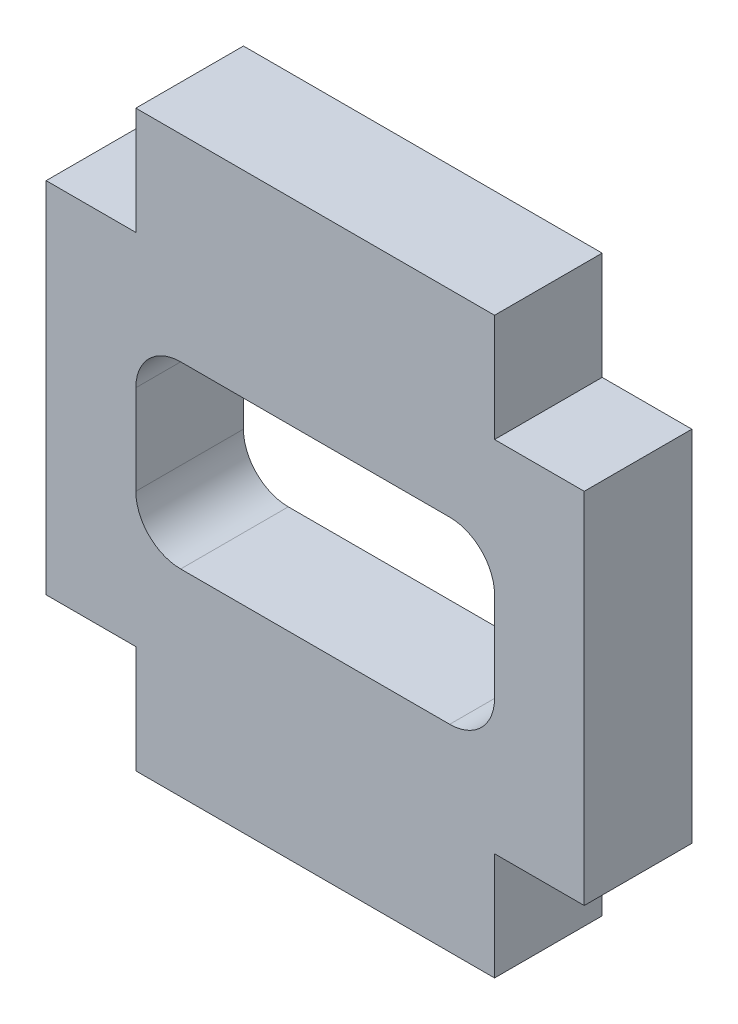
ISO-10303-21;
HEADER;
FILE_DESCRIPTION(('STEP AP214'),'2;1');
FILE_NAME('part.step','',(''),(''),'','','');
FILE_SCHEMA(('AUTOMOTIVE_DESIGN { 1 0 10303 214 1 1 1 1 }'));
ENDSEC;
DATA;
#1=APPLICATION_CONTEXT('core data for automotive mechanical design processes');
#2=APPLICATION_PROTOCOL_DEFINITION('international standard','automotive_design',2000,#1);
#3=PRODUCT_CONTEXT('',#1,'mechanical');
#4=PRODUCT('Part','Part','',(#3));
#5=PRODUCT_RELATED_PRODUCT_CATEGORY('part','',(#4));
#6=PRODUCT_DEFINITION_FORMATION('','',#4);
#7=PRODUCT_DEFINITION_CONTEXT('part definition',#1,'design');
#8=PRODUCT_DEFINITION('design','',#6,#7);
#9=PRODUCT_DEFINITION_SHAPE('','',#8);
#10=(LENGTH_UNIT() NAMED_UNIT(*) SI_UNIT(.MILLI.,.METRE.));
#11=(NAMED_UNIT(*) PLANE_ANGLE_UNIT() SI_UNIT($,.RADIAN.));
#12=(NAMED_UNIT(*) SI_UNIT($,.STERADIAN.) SOLID_ANGLE_UNIT());
#13=UNCERTAINTY_MEASURE_WITH_UNIT(LENGTH_MEASURE(1.E-05),#10,'distance_accuracy_value','');
#14=(GEOMETRIC_REPRESENTATION_CONTEXT(3) GLOBAL_UNCERTAINTY_ASSIGNED_CONTEXT((#13)) GLOBAL_UNIT_ASSIGNED_CONTEXT((#10,
#11,#12)) REPRESENTATION_CONTEXT('',''));
#15=CARTESIAN_POINT('',(0.,0.,0.));
#16=DIRECTION('',(0.,0.,1.));
#17=DIRECTION('',(1.,0.,0.));
#18=AXIS2_PLACEMENT_3D('',#15,#16,#17);
#19=CARTESIAN_POINT('',(5.,0.,3.));
#20=DIRECTION('',(-1.,0.,0.));
#21=DIRECTION('',(0.,0.,1.));
#22=AXIS2_PLACEMENT_3D('',#19,#20,#21);
#23=PLANE('',#22);
#24=DIRECTION('',(0.,1.,0.));
#25=VECTOR('',#24,1.);
#26=CARTESIAN_POINT('',(5.,0.,0.));
#27=LINE('',#26,#25);
#28=CARTESIAN_POINT('',(5.,-1.24999999999999,0.));
#29=VERTEX_POINT('',#28);
#30=CARTESIAN_POINT('',(5.,1.24999999999999,0.));
#31=VERTEX_POINT('',#30);
#32=EDGE_CURVE('E238',#29,#31,#27,.T.);
#33=ORIENTED_EDGE('',*,*,#32,.F.);
#34=DIRECTION('',(0.,0.,-1.));
#35=VECTOR('',#34,1.);
#36=CARTESIAN_POINT('',(5.,-1.24999999999999,3.));
#37=LINE('',#36,#35);
#38=CARTESIAN_POINT('',(5.,-1.24999999999999,3.));
#39=VERTEX_POINT('',#38);
#40=EDGE_CURVE('E11',#39,#29,#37,.T.);
#41=ORIENTED_EDGE('',*,*,#40,.F.);
#42=DIRECTION('',(0.,1.,0.));
#43=VECTOR('',#42,1.);
#44=CARTESIAN_POINT('',(5.,0.,3.));
#45=LINE('',#44,#43);
#46=CARTESIAN_POINT('',(5.,1.24999999999999,3.));
#47=VERTEX_POINT('',#46);
#48=EDGE_CURVE('E342',#39,#47,#45,.T.);
#49=ORIENTED_EDGE('',*,*,#48,.T.);
#50=DIRECTION('',(0.,0.,-1.));
#51=VECTOR('',#50,1.);
#52=CARTESIAN_POINT('',(5.,1.24999999999999,3.));
#53=LINE('',#52,#51);
#54=EDGE_CURVE('E53',#47,#31,#53,.T.);
#55=ORIENTED_EDGE('',*,*,#54,.T.);
#56=EDGE_LOOP('',(#33,#41,#49,#55));
#57=FACE_BOUND('',#56,.T.);
#58=ADVANCED_FACE('F34',(#57),#23,.T.);
#59=CARTESIAN_POINT('',(3.75,-1.25,3.));
#60=DIRECTION('',(0.,0.,-1.));
#61=DIRECTION('',(-1.,0.,0.));
#62=AXIS2_PLACEMENT_3D('',#59,#60,#61);
#63=CYLINDRICAL_SURFACE('',#62,1.25);
#64=CARTESIAN_POINT('',(3.75,-1.25,0.));
#65=DIRECTION('',(0.,0.,1.));
#66=DIRECTION('',(1.,0.,0.));
#67=AXIS2_PLACEMENT_3D('',#64,#65,#66);
#68=CIRCLE('',#67,1.25);
#69=CARTESIAN_POINT('',(3.74999999999999,-2.5,0.));
#70=VERTEX_POINT('',#69);
#71=EDGE_CURVE('E240',#29,#70,#68,.F.);
#72=ORIENTED_EDGE('',*,*,#71,.T.);
#73=DIRECTION('',(0.,0.,-1.));
#74=VECTOR('',#73,1.);
#75=CARTESIAN_POINT('',(3.74999999999999,-2.5,3.));
#76=LINE('',#75,#74);
#77=CARTESIAN_POINT('',(3.74999999999999,-2.5,3.));
#78=VERTEX_POINT('',#77);
#79=EDGE_CURVE('E44',#78,#70,#76,.T.);
#80=ORIENTED_EDGE('',*,*,#79,.F.);
#81=CARTESIAN_POINT('',(3.75,-1.25,3.));
#82=DIRECTION('',(0.,0.,1.));
#83=DIRECTION('',(1.,0.,0.));
#84=AXIS2_PLACEMENT_3D('',#81,#82,#83);
#85=CIRCLE('',#84,1.25);
#86=EDGE_CURVE('E344',#39,#78,#85,.F.);
#87=ORIENTED_EDGE('',*,*,#86,.F.);
#88=ORIENTED_EDGE('',*,*,#40,.T.);
#89=EDGE_LOOP('',(#72,#80,#87,#88));
#90=FACE_BOUND('',#89,.T.);
#91=ADVANCED_FACE('F373',(#90),#63,.F.);
#92=CARTESIAN_POINT('',(0.,-2.5,3.));
#93=DIRECTION('',(0.,-1.,0.));
#94=DIRECTION('',(1.,0.,0.));
#95=AXIS2_PLACEMENT_3D('',#92,#93,#94);
#96=PLANE('',#95);
#97=DIRECTION('',(-1.,0.,0.));
#98=VECTOR('',#97,1.);
#99=CARTESIAN_POINT('',(0.,-2.5,0.));
#100=LINE('',#99,#98);
#101=CARTESIAN_POINT('',(-3.74999999999999,-2.5,0.));
#102=VERTEX_POINT('',#101);
#103=EDGE_CURVE('E243',#70,#102,#100,.T.);
#104=ORIENTED_EDGE('',*,*,#103,.T.);
#105=DIRECTION('',(0.,0.,-1.));
#106=VECTOR('',#105,1.);
#107=CARTESIAN_POINT('',(-3.74999999999999,-2.5,3.));
#108=LINE('',#107,#106);
#109=CARTESIAN_POINT('',(-3.74999999999999,-2.5,3.));
#110=VERTEX_POINT('',#109);
#111=EDGE_CURVE('E265',#110,#102,#108,.T.);
#112=ORIENTED_EDGE('',*,*,#111,.F.);
#113=DIRECTION('',(-1.,0.,0.));
#114=VECTOR('',#113,1.);
#115=CARTESIAN_POINT('',(0.,-2.5,3.));
#116=LINE('',#115,#114);
#117=EDGE_CURVE('E347',#78,#110,#116,.T.);
#118=ORIENTED_EDGE('',*,*,#117,.F.);
#119=ORIENTED_EDGE('',*,*,#79,.T.);
#120=EDGE_LOOP('',(#104,#112,#118,#119));
#121=FACE_BOUND('',#120,.T.);
#122=ADVANCED_FACE('F378',(#121),#96,.F.);
#123=CARTESIAN_POINT('',(-3.75,-1.25,3.));
#124=DIRECTION('',(0.,0.,-1.));
#125=DIRECTION('',(-1.,0.,0.));
#126=AXIS2_PLACEMENT_3D('',#123,#124,#125);
#127=CYLINDRICAL_SURFACE('',#126,1.25);
#128=CARTESIAN_POINT('',(-3.75,-1.25,0.));
#129=DIRECTION('',(0.,0.,1.));
#130=DIRECTION('',(1.,0.,0.));
#131=AXIS2_PLACEMENT_3D('',#128,#129,#130);
#132=CIRCLE('',#131,1.25);
#133=CARTESIAN_POINT('',(-5.,-1.24999999999999,0.));
#134=VERTEX_POINT('',#133);
#135=EDGE_CURVE('E246',#102,#134,#132,.F.);
#136=ORIENTED_EDGE('',*,*,#135,.T.);
#137=DIRECTION('',(0.,0.,-1.));
#138=VECTOR('',#137,1.);
#139=CARTESIAN_POINT('',(-5.,-1.24999999999999,3.));
#140=LINE('',#139,#138);
#141=CARTESIAN_POINT('',(-5.,-1.24999999999999,3.));
#142=VERTEX_POINT('',#141);
#143=EDGE_CURVE('E262',#142,#134,#140,.T.);
#144=ORIENTED_EDGE('',*,*,#143,.F.);
#145=CARTESIAN_POINT('',(-3.75,-1.25,3.));
#146=DIRECTION('',(0.,0.,1.));
#147=DIRECTION('',(1.,0.,0.));
#148=AXIS2_PLACEMENT_3D('',#145,#146,#147);
#149=CIRCLE('',#148,1.25);
#150=EDGE_CURVE('E350',#110,#142,#149,.F.);
#151=ORIENTED_EDGE('',*,*,#150,.F.);
#152=ORIENTED_EDGE('',*,*,#111,.T.);
#153=EDGE_LOOP('',(#136,#144,#151,#152));
#154=FACE_BOUND('',#153,.T.);
#155=ADVANCED_FACE('F354',(#154),#127,.F.);
#156=CARTESIAN_POINT('',(-5.,0.,3.));
#157=DIRECTION('',(-1.,0.,0.));
#158=DIRECTION('',(0.,0.,1.));
#159=AXIS2_PLACEMENT_3D('',#156,#157,#158);
#160=PLANE('',#159);
#161=DIRECTION('',(0.,1.,0.));
#162=VECTOR('',#161,1.);
#163=CARTESIAN_POINT('',(-5.,0.,0.));
#164=LINE('',#163,#162);
#165=CARTESIAN_POINT('',(-5.,1.24999999999999,0.));
#166=VERTEX_POINT('',#165);
#167=EDGE_CURVE('E249',#134,#166,#164,.T.);
#168=ORIENTED_EDGE('',*,*,#167,.T.);
#169=DIRECTION('',(0.,0.,-1.));
#170=VECTOR('',#169,1.);
#171=CARTESIAN_POINT('',(-5.,1.24999999999999,3.));
#172=LINE('',#171,#170);
#173=CARTESIAN_POINT('',(-5.,1.24999999999999,3.));
#174=VERTEX_POINT('',#173);
#175=EDGE_CURVE('E187',#174,#166,#172,.T.);
#176=ORIENTED_EDGE('',*,*,#175,.F.);
#177=DIRECTION('',(0.,1.,0.));
#178=VECTOR('',#177,1.);
#179=CARTESIAN_POINT('',(-5.,0.,3.));
#180=LINE('',#179,#178);
#181=EDGE_CURVE('E196',#142,#174,#180,.T.);
#182=ORIENTED_EDGE('',*,*,#181,.F.);
#183=ORIENTED_EDGE('',*,*,#143,.T.);
#184=EDGE_LOOP('',(#168,#176,#182,#183));
#185=FACE_BOUND('',#184,.T.);
#186=ADVANCED_FACE('F356',(#185),#160,.F.);
#187=CARTESIAN_POINT('',(-3.75,1.25,3.));
#188=DIRECTION('',(0.,0.,-1.));
#189=DIRECTION('',(-1.,0.,0.));
#190=AXIS2_PLACEMENT_3D('',#187,#188,#189);
#191=CYLINDRICAL_SURFACE('',#190,1.25);
#192=CARTESIAN_POINT('',(-3.75,1.25,0.));
#193=DIRECTION('',(0.,0.,1.));
#194=DIRECTION('',(1.,0.,0.));
#195=AXIS2_PLACEMENT_3D('',#192,#193,#194);
#196=CIRCLE('',#195,1.25);
#197=CARTESIAN_POINT('',(-3.74999999999999,2.5,0.));
#198=VERTEX_POINT('',#197);
#199=EDGE_CURVE('E183',#198,#166,#196,.T.);
#200=ORIENTED_EDGE('',*,*,#199,.F.);
#201=DIRECTION('',(0.,0.,-1.));
#202=VECTOR('',#201,1.);
#203=CARTESIAN_POINT('',(-3.74999999999999,2.5,3.));
#204=LINE('',#203,#202);
#205=CARTESIAN_POINT('',(-3.74999999999999,2.5,3.));
#206=VERTEX_POINT('',#205);
#207=EDGE_CURVE('E178',#206,#198,#204,.T.);
#208=ORIENTED_EDGE('',*,*,#207,.F.);
#209=CARTESIAN_POINT('',(-3.75,1.25,3.));
#210=DIRECTION('',(0.,0.,1.));
#211=DIRECTION('',(1.,0.,0.));
#212=AXIS2_PLACEMENT_3D('',#209,#210,#211);
#213=CIRCLE('',#212,1.25);
#214=EDGE_CURVE('E181',#206,#174,#213,.T.);
#215=ORIENTED_EDGE('',*,*,#214,.T.);
#216=ORIENTED_EDGE('',*,*,#175,.T.);
#217=EDGE_LOOP('',(#200,#208,#215,#216));
#218=FACE_BOUND('',#217,.T.);
#219=ADVANCED_FACE('F180',(#218),#191,.F.);
#220=CARTESIAN_POINT('',(0.,2.5,3.));
#221=DIRECTION('',(0.,-1.,0.));
#222=DIRECTION('',(1.,0.,0.));
#223=AXIS2_PLACEMENT_3D('',#220,#221,#222);
#224=PLANE('',#223);
#225=DIRECTION('',(-1.,0.,0.));
#226=VECTOR('',#225,1.);
#227=CARTESIAN_POINT('',(0.,2.5,0.));
#228=LINE('',#227,#226);
#229=CARTESIAN_POINT('',(3.74999999999999,2.5,0.));
#230=VERTEX_POINT('',#229);
#231=EDGE_CURVE('E253',#230,#198,#228,.T.);
#232=ORIENTED_EDGE('',*,*,#231,.F.);
#233=DIRECTION('',(0.,0.,-1.));
#234=VECTOR('',#233,1.);
#235=CARTESIAN_POINT('',(3.74999999999999,2.5,3.));
#236=LINE('',#235,#234);
#237=CARTESIAN_POINT('',(3.74999999999999,2.5,3.));
#238=VERTEX_POINT('',#237);
#239=EDGE_CURVE('E114',#238,#230,#236,.T.);
#240=ORIENTED_EDGE('',*,*,#239,.F.);
#241=DIRECTION('',(-1.,0.,0.));
#242=VECTOR('',#241,1.);
#243=CARTESIAN_POINT('',(0.,2.5,3.));
#244=LINE('',#243,#242);
#245=EDGE_CURVE('E194',#238,#206,#244,.T.);
#246=ORIENTED_EDGE('',*,*,#245,.T.);
#247=ORIENTED_EDGE('',*,*,#207,.T.);
#248=EDGE_LOOP('',(#232,#240,#246,#247));
#249=FACE_BOUND('',#248,.T.);
#250=ADVANCED_FACE('F199',(#249),#224,.T.);
#251=CARTESIAN_POINT('',(5.,0.,3.));
#252=DIRECTION('',(1.,0.,0.));
#253=DIRECTION('',(0.,1.,0.));
#254=AXIS2_PLACEMENT_3D('',#251,#252,#253);
#255=PLANE('',#254);
#256=DIRECTION('',(0.,-1.,0.));
#257=VECTOR('',#256,1.);
#258=CARTESIAN_POINT('',(5.,0.,0.));
#259=LINE('',#258,#257);
#260=CARTESIAN_POINT('',(5.,-5.,0.));
#261=VERTEX_POINT('',#260);
#262=CARTESIAN_POINT('',(5.,-8.,0.));
#263=VERTEX_POINT('',#262);
#264=EDGE_CURVE('E206',#261,#263,#259,.T.);
#265=ORIENTED_EDGE('',*,*,#264,.F.);
#266=DIRECTION('',(0.,0.,-1.));
#267=VECTOR('',#266,1.);
#268=CARTESIAN_POINT('',(5.,-5.,3.));
#269=LINE('',#268,#267);
#270=CARTESIAN_POINT('',(5.,-5.,3.));
#271=VERTEX_POINT('',#270);
#272=EDGE_CURVE('E38',#271,#261,#269,.T.);
#273=ORIENTED_EDGE('',*,*,#272,.F.);
#274=DIRECTION('',(0.,-1.,0.));
#275=VECTOR('',#274,1.);
#276=CARTESIAN_POINT('',(5.,0.,3.));
#277=LINE('',#276,#275);
#278=CARTESIAN_POINT('',(5.,-8.,3.));
#279=VERTEX_POINT('',#278);
#280=EDGE_CURVE('E258',#271,#279,#277,.T.);
#281=ORIENTED_EDGE('',*,*,#280,.T.);
#282=DIRECTION('',(0.,0.,-1.));
#283=VECTOR('',#282,1.);
#284=CARTESIAN_POINT('',(5.,-8.,3.));
#285=LINE('',#284,#283);
#286=EDGE_CURVE('E202',#279,#263,#285,.T.);
#287=ORIENTED_EDGE('',*,*,#286,.T.);
#288=EDGE_LOOP('',(#265,#273,#281,#287));
#289=FACE_BOUND('',#288,.T.);
#290=ADVANCED_FACE('F36',(#289),#255,.T.);
#291=CARTESIAN_POINT('',(0.,-5.,3.));
#292=DIRECTION('',(0.,-1.,0.));
#293=DIRECTION('',(0.,0.,-1.));
#294=AXIS2_PLACEMENT_3D('',#291,#292,#293);
#295=PLANE('',#294);
#296=DIRECTION('',(-1.,0.,0.));
#297=VECTOR('',#296,1.);
#298=CARTESIAN_POINT('',(0.,-5.,0.));
#299=LINE('',#298,#297);
#300=CARTESIAN_POINT('',(7.5,-5.,0.));
#301=VERTEX_POINT('',#300);
#302=EDGE_CURVE('E209',#301,#261,#299,.T.);
#303=ORIENTED_EDGE('',*,*,#302,.F.);
#304=DIRECTION('',(0.,0.,-1.));
#305=VECTOR('',#304,1.);
#306=CARTESIAN_POINT('',(7.5,-5.,3.));
#307=LINE('',#306,#305);
#308=CARTESIAN_POINT('',(7.5,-5.,3.));
#309=VERTEX_POINT('',#308);
#310=EDGE_CURVE('E292',#309,#301,#307,.T.);
#311=ORIENTED_EDGE('',*,*,#310,.F.);
#312=DIRECTION('',(-1.,0.,0.));
#313=VECTOR('',#312,1.);
#314=CARTESIAN_POINT('',(0.,-5.,3.));
#315=LINE('',#314,#313);
#316=EDGE_CURVE('E301',#309,#271,#315,.T.);
#317=ORIENTED_EDGE('',*,*,#316,.T.);
#318=ORIENTED_EDGE('',*,*,#272,.T.);
#319=EDGE_LOOP('',(#303,#311,#317,#318));
#320=FACE_BOUND('',#319,.T.);
#321=ADVANCED_FACE('F299',(#320),#295,.T.);
#322=CARTESIAN_POINT('',(7.5,0.,3.));
#323=DIRECTION('',(-1.,0.,0.));
#324=DIRECTION('',(0.,0.,1.));
#325=AXIS2_PLACEMENT_3D('',#322,#323,#324);
#326=PLANE('',#325);
#327=DIRECTION('',(0.,1.,0.));
#328=VECTOR('',#327,1.);
#329=CARTESIAN_POINT('',(7.5,0.,0.));
#330=LINE('',#329,#328);
#331=CARTESIAN_POINT('',(7.5,5.,0.));
#332=VERTEX_POINT('',#331);
#333=EDGE_CURVE('E212',#301,#332,#330,.T.);
#334=ORIENTED_EDGE('',*,*,#333,.T.);
#335=DIRECTION('',(0.,0.,-1.));
#336=VECTOR('',#335,1.);
#337=CARTESIAN_POINT('',(7.5,5.,3.));
#338=LINE('',#337,#336);
#339=CARTESIAN_POINT('',(7.5,5.,3.));
#340=VERTEX_POINT('',#339);
#341=EDGE_CURVE('E290',#340,#332,#338,.T.);
#342=ORIENTED_EDGE('',*,*,#341,.F.);
#343=DIRECTION('',(0.,1.,0.));
#344=VECTOR('',#343,1.);
#345=CARTESIAN_POINT('',(7.5,0.,3.));
#346=LINE('',#345,#344);
#347=EDGE_CURVE('E318',#309,#340,#346,.T.);
#348=ORIENTED_EDGE('',*,*,#347,.F.);
#349=ORIENTED_EDGE('',*,*,#310,.T.);
#350=EDGE_LOOP('',(#334,#342,#348,#349));
#351=FACE_BOUND('',#350,.T.);
#352=ADVANCED_FACE('F309',(#351),#326,.F.);
#353=CARTESIAN_POINT('',(0.,5.,3.));
#354=DIRECTION('',(0.,-1.,0.));
#355=DIRECTION('',(0.,0.,-1.));
#356=AXIS2_PLACEMENT_3D('',#353,#354,#355);
#357=PLANE('',#356);
#358=DIRECTION('',(-1.,0.,0.));
#359=VECTOR('',#358,1.);
#360=CARTESIAN_POINT('',(0.,5.,0.));
#361=LINE('',#360,#359);
#362=CARTESIAN_POINT('',(5.,5.,0.));
#363=VERTEX_POINT('',#362);
#364=EDGE_CURVE('E214',#332,#363,#361,.T.);
#365=ORIENTED_EDGE('',*,*,#364,.T.);
#366=DIRECTION('',(0.,0.,-1.));
#367=VECTOR('',#366,1.);
#368=CARTESIAN_POINT('',(5.,5.,3.));
#369=LINE('',#368,#367);
#370=CARTESIAN_POINT('',(5.,5.,3.));
#371=VERTEX_POINT('',#370);
#372=EDGE_CURVE('E287',#371,#363,#369,.T.);
#373=ORIENTED_EDGE('',*,*,#372,.F.);
#374=DIRECTION('',(-1.,0.,0.));
#375=VECTOR('',#374,1.);
#376=CARTESIAN_POINT('',(0.,5.,3.));
#377=LINE('',#376,#375);
#378=EDGE_CURVE('E314',#340,#371,#377,.T.);
#379=ORIENTED_EDGE('',*,*,#378,.F.);
#380=ORIENTED_EDGE('',*,*,#341,.T.);
#381=EDGE_LOOP('',(#365,#373,#379,#380));
#382=FACE_BOUND('',#381,.T.);
#383=ADVANCED_FACE('F312',(#382),#357,.F.);
#384=CARTESIAN_POINT('',(5.,0.,3.));
#385=DIRECTION('',(-1.,0.,0.));
#386=DIRECTION('',(0.,0.,1.));
#387=AXIS2_PLACEMENT_3D('',#384,#385,#386);
#388=PLANE('',#387);
#389=DIRECTION('',(0.,1.,0.));
#390=VECTOR('',#389,1.);
#391=CARTESIAN_POINT('',(5.,0.,0.));
#392=LINE('',#391,#390);
#393=CARTESIAN_POINT('',(5.,8.,0.));
#394=VERTEX_POINT('',#393);
#395=EDGE_CURVE('E216',#363,#394,#392,.T.);
#396=ORIENTED_EDGE('',*,*,#395,.T.);
#397=DIRECTION('',(0.,0.,-1.));
#398=VECTOR('',#397,1.);
#399=CARTESIAN_POINT('',(5.,8.,3.));
#400=LINE('',#399,#398);
#401=CARTESIAN_POINT('',(5.,8.,3.));
#402=VERTEX_POINT('',#401);
#403=EDGE_CURVE('E284',#402,#394,#400,.T.);
#404=ORIENTED_EDGE('',*,*,#403,.F.);
#405=DIRECTION('',(0.,1.,0.));
#406=VECTOR('',#405,1.);
#407=CARTESIAN_POINT('',(5.,0.,3.));
#408=LINE('',#407,#406);
#409=EDGE_CURVE('E317',#371,#402,#408,.T.);
#410=ORIENTED_EDGE('',*,*,#409,.F.);
#411=ORIENTED_EDGE('',*,*,#372,.T.);
#412=EDGE_LOOP('',(#396,#404,#410,#411));
#413=FACE_BOUND('',#412,.T.);
#414=ADVANCED_FACE('F405',(#413),#388,.F.);
#415=CARTESIAN_POINT('',(0.,8.,3.));
#416=DIRECTION('',(0.,-1.,0.));
#417=DIRECTION('',(0.,0.,-1.));
#418=AXIS2_PLACEMENT_3D('',#415,#416,#417);
#419=PLANE('',#418);
#420=DIRECTION('',(-1.,0.,0.));
#421=VECTOR('',#420,1.);
#422=CARTESIAN_POINT('',(0.,8.,0.));
#423=LINE('',#422,#421);
#424=CARTESIAN_POINT('',(-5.,8.,0.));
#425=VERTEX_POINT('',#424);
#426=EDGE_CURVE('E218',#394,#425,#423,.T.);
#427=ORIENTED_EDGE('',*,*,#426,.T.);
#428=DIRECTION('',(0.,0.,-1.));
#429=VECTOR('',#428,1.);
#430=CARTESIAN_POINT('',(-5.,8.,3.));
#431=LINE('',#430,#429);
#432=CARTESIAN_POINT('',(-5.,8.,3.));
#433=VERTEX_POINT('',#432);
#434=EDGE_CURVE('E282',#433,#425,#431,.T.);
#435=ORIENTED_EDGE('',*,*,#434,.F.);
#436=DIRECTION('',(-1.,0.,0.));
#437=VECTOR('',#436,1.);
#438=CARTESIAN_POINT('',(0.,8.,3.));
#439=LINE('',#438,#437);
#440=EDGE_CURVE('E320',#402,#433,#439,.T.);
#441=ORIENTED_EDGE('',*,*,#440,.F.);
#442=ORIENTED_EDGE('',*,*,#403,.T.);
#443=EDGE_LOOP('',(#427,#435,#441,#442));
#444=FACE_BOUND('',#443,.T.);
#445=ADVANCED_FACE('F401',(#444),#419,.F.);
#446=CARTESIAN_POINT('',(-5.,0.,3.));
#447=DIRECTION('',(-1.,0.,0.));
#448=DIRECTION('',(0.,0.,1.));
#449=AXIS2_PLACEMENT_3D('',#446,#447,#448);
#450=PLANE('',#449);
#451=DIRECTION('',(0.,1.,0.));
#452=VECTOR('',#451,1.);
#453=CARTESIAN_POINT('',(-5.,0.,0.));
#454=LINE('',#453,#452);
#455=CARTESIAN_POINT('',(-5.,5.,0.));
#456=VERTEX_POINT('',#455);
#457=EDGE_CURVE('E221',#456,#425,#454,.T.);
#458=ORIENTED_EDGE('',*,*,#457,.F.);
#459=DIRECTION('',(0.,0.,-1.));
#460=VECTOR('',#459,1.);
#461=CARTESIAN_POINT('',(-5.,5.,3.));
#462=LINE('',#461,#460);
#463=CARTESIAN_POINT('',(-5.,5.,3.));
#464=VERTEX_POINT('',#463);
#465=EDGE_CURVE('E280',#464,#456,#462,.T.);
#466=ORIENTED_EDGE('',*,*,#465,.F.);
#467=DIRECTION('',(0.,1.,0.));
#468=VECTOR('',#467,1.);
#469=CARTESIAN_POINT('',(-5.,0.,3.));
#470=LINE('',#469,#468);
#471=EDGE_CURVE('E326',#464,#433,#470,.T.);
#472=ORIENTED_EDGE('',*,*,#471,.T.);
#473=ORIENTED_EDGE('',*,*,#434,.T.);
#474=EDGE_LOOP('',(#458,#466,#472,#473));
#475=FACE_BOUND('',#474,.T.);
#476=ADVANCED_FACE('F397',(#475),#450,.T.);
#477=CARTESIAN_POINT('',(0.,5.,3.));
#478=DIRECTION('',(0.,1.,0.));
#479=DIRECTION('',(0.,0.,1.));
#480=AXIS2_PLACEMENT_3D('',#477,#478,#479);
#481=PLANE('',#480);
#482=DIRECTION('',(1.,0.,0.));
#483=VECTOR('',#482,1.);
#484=CARTESIAN_POINT('',(0.,5.,0.));
#485=LINE('',#484,#483);
#486=CARTESIAN_POINT('',(-7.5,5.,0.));
#487=VERTEX_POINT('',#486);
#488=EDGE_CURVE('E224',#487,#456,#485,.T.);
#489=ORIENTED_EDGE('',*,*,#488,.F.);
#490=DIRECTION('',(0.,0.,-1.));
#491=VECTOR('',#490,1.);
#492=CARTESIAN_POINT('',(-7.5,5.,3.));
#493=LINE('',#492,#491);
#494=CARTESIAN_POINT('',(-7.5,5.,3.));
#495=VERTEX_POINT('',#494);
#496=EDGE_CURVE('E278',#495,#487,#493,.T.);
#497=ORIENTED_EDGE('',*,*,#496,.F.);
#498=DIRECTION('',(1.,0.,0.));
#499=VECTOR('',#498,1.);
#500=CARTESIAN_POINT('',(0.,5.,3.));
#501=LINE('',#500,#499);
#502=EDGE_CURVE('E329',#495,#464,#501,.T.);
#503=ORIENTED_EDGE('',*,*,#502,.T.);
#504=ORIENTED_EDGE('',*,*,#465,.T.);
#505=EDGE_LOOP('',(#489,#497,#503,#504));
#506=FACE_BOUND('',#505,.T.);
#507=ADVANCED_FACE('F393',(#506),#481,.T.);
#508=CARTESIAN_POINT('',(-7.5,0.,3.));
#509=DIRECTION('',(-1.,0.,0.));
#510=DIRECTION('',(0.,0.,1.));
#511=AXIS2_PLACEMENT_3D('',#508,#509,#510);
#512=PLANE('',#511);
#513=DIRECTION('',(0.,1.,0.));
#514=VECTOR('',#513,1.);
#515=CARTESIAN_POINT('',(-7.5,0.,0.));
#516=LINE('',#515,#514);
#517=CARTESIAN_POINT('',(-7.5,-5.,0.));
#518=VERTEX_POINT('',#517);
#519=EDGE_CURVE('E227',#518,#487,#516,.T.);
#520=ORIENTED_EDGE('',*,*,#519,.F.);
#521=DIRECTION('',(0.,0.,-1.));
#522=VECTOR('',#521,1.);
#523=CARTESIAN_POINT('',(-7.5,-5.,3.));
#524=LINE('',#523,#522);
#525=CARTESIAN_POINT('',(-7.5,-5.,3.));
#526=VERTEX_POINT('',#525);
#527=EDGE_CURVE('E276',#526,#518,#524,.T.);
#528=ORIENTED_EDGE('',*,*,#527,.F.);
#529=DIRECTION('',(0.,1.,0.));
#530=VECTOR('',#529,1.);
#531=CARTESIAN_POINT('',(-7.5,0.,3.));
#532=LINE('',#531,#530);
#533=EDGE_CURVE('E332',#526,#495,#532,.T.);
#534=ORIENTED_EDGE('',*,*,#533,.T.);
#535=ORIENTED_EDGE('',*,*,#496,.T.);
#536=EDGE_LOOP('',(#520,#528,#534,#535));
#537=FACE_BOUND('',#536,.T.);
#538=ADVANCED_FACE('F389',(#537),#512,.T.);
#539=CARTESIAN_POINT('',(0.,-5.,3.));
#540=DIRECTION('',(0.,1.,0.));
#541=DIRECTION('',(0.,0.,1.));
#542=AXIS2_PLACEMENT_3D('',#539,#540,#541);
#543=PLANE('',#542);
#544=DIRECTION('',(1.,0.,0.));
#545=VECTOR('',#544,1.);
#546=CARTESIAN_POINT('',(0.,-5.,0.));
#547=LINE('',#546,#545);
#548=CARTESIAN_POINT('',(-5.,-5.,0.));
#549=VERTEX_POINT('',#548);
#550=EDGE_CURVE('E230',#518,#549,#547,.T.);
#551=ORIENTED_EDGE('',*,*,#550,.T.);
#552=DIRECTION('',(0.,0.,-1.));
#553=VECTOR('',#552,1.);
#554=CARTESIAN_POINT('',(-5.,-5.,3.));
#555=LINE('',#554,#553);
#556=CARTESIAN_POINT('',(-5.,-5.,3.));
#557=VERTEX_POINT('',#556);
#558=EDGE_CURVE('E273',#557,#549,#555,.T.);
#559=ORIENTED_EDGE('',*,*,#558,.F.);
#560=DIRECTION('',(1.,0.,0.));
#561=VECTOR('',#560,1.);
#562=CARTESIAN_POINT('',(0.,-5.,3.));
#563=LINE('',#562,#561);
#564=EDGE_CURVE('E335',#526,#557,#563,.T.);
#565=ORIENTED_EDGE('',*,*,#564,.F.);
#566=ORIENTED_EDGE('',*,*,#527,.T.);
#567=EDGE_LOOP('',(#551,#559,#565,#566));
#568=FACE_BOUND('',#567,.T.);
#569=ADVANCED_FACE('F385',(#568),#543,.F.);
#570=CARTESIAN_POINT('',(-5.,0.,3.));
#571=DIRECTION('',(1.,0.,0.));
#572=DIRECTION('',(0.,1.,0.));
#573=AXIS2_PLACEMENT_3D('',#570,#571,#572);
#574=PLANE('',#573);
#575=DIRECTION('',(0.,-1.,0.));
#576=VECTOR('',#575,1.);
#577=CARTESIAN_POINT('',(-5.,0.,0.));
#578=LINE('',#577,#576);
#579=CARTESIAN_POINT('',(-5.,-8.,0.));
#580=VERTEX_POINT('',#579);
#581=EDGE_CURVE('E232',#549,#580,#578,.T.);
#582=ORIENTED_EDGE('',*,*,#581,.T.);
#583=DIRECTION('',(0.,0.,-1.));
#584=VECTOR('',#583,1.);
#585=CARTESIAN_POINT('',(-5.,-8.,3.));
#586=LINE('',#585,#584);
#587=CARTESIAN_POINT('',(-5.,-8.,3.));
#588=VERTEX_POINT('',#587);
#589=EDGE_CURVE('E271',#588,#580,#586,.T.);
#590=ORIENTED_EDGE('',*,*,#589,.F.);
#591=DIRECTION('',(0.,-1.,0.));
#592=VECTOR('',#591,1.);
#593=CARTESIAN_POINT('',(-5.,0.,3.));
#594=LINE('',#593,#592);
#595=EDGE_CURVE('E337',#557,#588,#594,.T.);
#596=ORIENTED_EDGE('',*,*,#595,.F.);
#597=ORIENTED_EDGE('',*,*,#558,.T.);
#598=EDGE_LOOP('',(#582,#590,#596,#597));
#599=FACE_BOUND('',#598,.T.);
#600=ADVANCED_FACE('F367',(#599),#574,.F.);
#601=CARTESIAN_POINT('',(0.,-8.,3.));
#602=DIRECTION('',(0.,-1.,0.));
#603=DIRECTION('',(1.,0.,0.));
#604=AXIS2_PLACEMENT_3D('',#601,#602,#603);
#605=PLANE('',#604);
#606=DIRECTION('',(-1.,0.,0.));
#607=VECTOR('',#606,1.);
#608=CARTESIAN_POINT('',(0.,-8.,0.));
#609=LINE('',#608,#607);
#610=EDGE_CURVE('E235',#263,#580,#609,.T.);
#611=ORIENTED_EDGE('',*,*,#610,.F.);
#612=ORIENTED_EDGE('',*,*,#286,.F.);
#613=DIRECTION('',(-1.,0.,0.));
#614=VECTOR('',#613,1.);
#615=CARTESIAN_POINT('',(0.,-8.,3.));
#616=LINE('',#615,#614);
#617=EDGE_CURVE('E339',#279,#588,#616,.T.);
#618=ORIENTED_EDGE('',*,*,#617,.T.);
#619=ORIENTED_EDGE('',*,*,#589,.T.);
#620=EDGE_LOOP('',(#611,#612,#618,#619));
#621=FACE_BOUND('',#620,.T.);
#622=ADVANCED_FACE('F360',(#621),#605,.T.);
#623=CARTESIAN_POINT('',(3.75,1.25,3.));
#624=DIRECTION('',(0.,0.,-1.));
#625=DIRECTION('',(-1.,0.,0.));
#626=AXIS2_PLACEMENT_3D('',#623,#624,#625);
#627=CYLINDRICAL_SURFACE('',#626,1.25);
#628=CARTESIAN_POINT('',(3.75,1.25,0.));
#629=DIRECTION('',(0.,0.,1.));
#630=DIRECTION('',(1.,0.,0.));
#631=AXIS2_PLACEMENT_3D('',#628,#629,#630);
#632=CIRCLE('',#631,1.25);
#633=EDGE_CURVE('E255',#31,#230,#632,.T.);
#634=ORIENTED_EDGE('',*,*,#633,.F.);
#635=ORIENTED_EDGE('',*,*,#54,.F.);
#636=CARTESIAN_POINT('',(3.75,1.25,3.));
#637=DIRECTION('',(0.,0.,1.));
#638=DIRECTION('',(1.,0.,0.));
#639=AXIS2_PLACEMENT_3D('',#636,#637,#638);
#640=CIRCLE('',#639,1.25);
#641=EDGE_CURVE('E200',#47,#238,#640,.T.);
#642=ORIENTED_EDGE('',*,*,#641,.T.);
#643=ORIENTED_EDGE('',*,*,#239,.T.);
#644=EDGE_LOOP('',(#634,#635,#642,#643));
#645=FACE_BOUND('',#644,.T.);
#646=ADVANCED_FACE('F358',(#645),#627,.F.);
#647=CARTESIAN_POINT('',(0.,0.,3.));
#648=DIRECTION('',(0.,0.,1.));
#649=DIRECTION('',(1.,0.,0.));
#650=AXIS2_PLACEMENT_3D('',#647,#648,#649);
#651=PLANE('',#650);
#652=ORIENTED_EDGE('',*,*,#280,.F.);
#653=ORIENTED_EDGE('',*,*,#316,.F.);
#654=ORIENTED_EDGE('',*,*,#347,.T.);
#655=ORIENTED_EDGE('',*,*,#378,.T.);
#656=ORIENTED_EDGE('',*,*,#409,.T.);
#657=ORIENTED_EDGE('',*,*,#440,.T.);
#658=ORIENTED_EDGE('',*,*,#471,.F.);
#659=ORIENTED_EDGE('',*,*,#502,.F.);
#660=ORIENTED_EDGE('',*,*,#533,.F.);
#661=ORIENTED_EDGE('',*,*,#564,.T.);
#662=ORIENTED_EDGE('',*,*,#595,.T.);
#663=ORIENTED_EDGE('',*,*,#617,.F.);
#664=EDGE_LOOP('',(#652,#653,#654,#655,#656,#657,#658,#659,#660,#661,#662,#663));
#665=FACE_BOUND('',#664,.T.);
#666=ORIENTED_EDGE('',*,*,#48,.F.);
#667=ORIENTED_EDGE('',*,*,#86,.T.);
#668=ORIENTED_EDGE('',*,*,#117,.T.);
#669=ORIENTED_EDGE('',*,*,#150,.T.);
#670=ORIENTED_EDGE('',*,*,#181,.T.);
#671=ORIENTED_EDGE('',*,*,#214,.F.);
#672=ORIENTED_EDGE('',*,*,#245,.F.);
#673=ORIENTED_EDGE('',*,*,#641,.F.);
#674=EDGE_LOOP('',(#666,#667,#668,#669,#670,#671,#672,#673));
#675=FACE_BOUND('',#674,.T.);
#676=ADVANCED_FACE('F192',(#665,#675),#651,.T.);
#677=CARTESIAN_POINT('',(0.,0.,0.));
#678=DIRECTION('',(0.,0.,1.));
#679=DIRECTION('',(1.,0.,0.));
#680=AXIS2_PLACEMENT_3D('',#677,#678,#679);
#681=PLANE('',#680);
#682=ORIENTED_EDGE('',*,*,#264,.T.);
#683=ORIENTED_EDGE('',*,*,#610,.T.);
#684=ORIENTED_EDGE('',*,*,#581,.F.);
#685=ORIENTED_EDGE('',*,*,#550,.F.);
#686=ORIENTED_EDGE('',*,*,#519,.T.);
#687=ORIENTED_EDGE('',*,*,#488,.T.);
#688=ORIENTED_EDGE('',*,*,#457,.T.);
#689=ORIENTED_EDGE('',*,*,#426,.F.);
#690=ORIENTED_EDGE('',*,*,#395,.F.);
#691=ORIENTED_EDGE('',*,*,#364,.F.);
#692=ORIENTED_EDGE('',*,*,#333,.F.);
#693=ORIENTED_EDGE('',*,*,#302,.T.);
#694=EDGE_LOOP('',(#682,#683,#684,#685,#686,#687,#688,#689,#690,#691,#692,#693));
#695=FACE_BOUND('',#694,.T.);
#696=ORIENTED_EDGE('',*,*,#32,.T.);
#697=ORIENTED_EDGE('',*,*,#633,.T.);
#698=ORIENTED_EDGE('',*,*,#231,.T.);
#699=ORIENTED_EDGE('',*,*,#199,.T.);
#700=ORIENTED_EDGE('',*,*,#167,.F.);
#701=ORIENTED_EDGE('',*,*,#135,.F.);
#702=ORIENTED_EDGE('',*,*,#103,.F.);
#703=ORIENTED_EDGE('',*,*,#71,.F.);
#704=EDGE_LOOP('',(#696,#697,#698,#699,#700,#701,#702,#703));
#705=FACE_BOUND('',#704,.T.);
#706=ADVANCED_FACE('F304',(#695,#705),#681,.F.);
#707=CLOSED_SHELL('',(#58,#91,#122,#155,#186,#219,#250,#290,#321,#352,#383,#414,#445,#476,#507,
#538,#569,#600,#622,#646,#676,#706));
#708=MANIFOLD_SOLID_BREP('B2',#707);
#709=ADVANCED_BREP_SHAPE_REPRESENTATION('',(#18,#708),#14);
#710=SHAPE_DEFINITION_REPRESENTATION(#9,#709);
ENDSEC;
END-ISO-10303-21;
